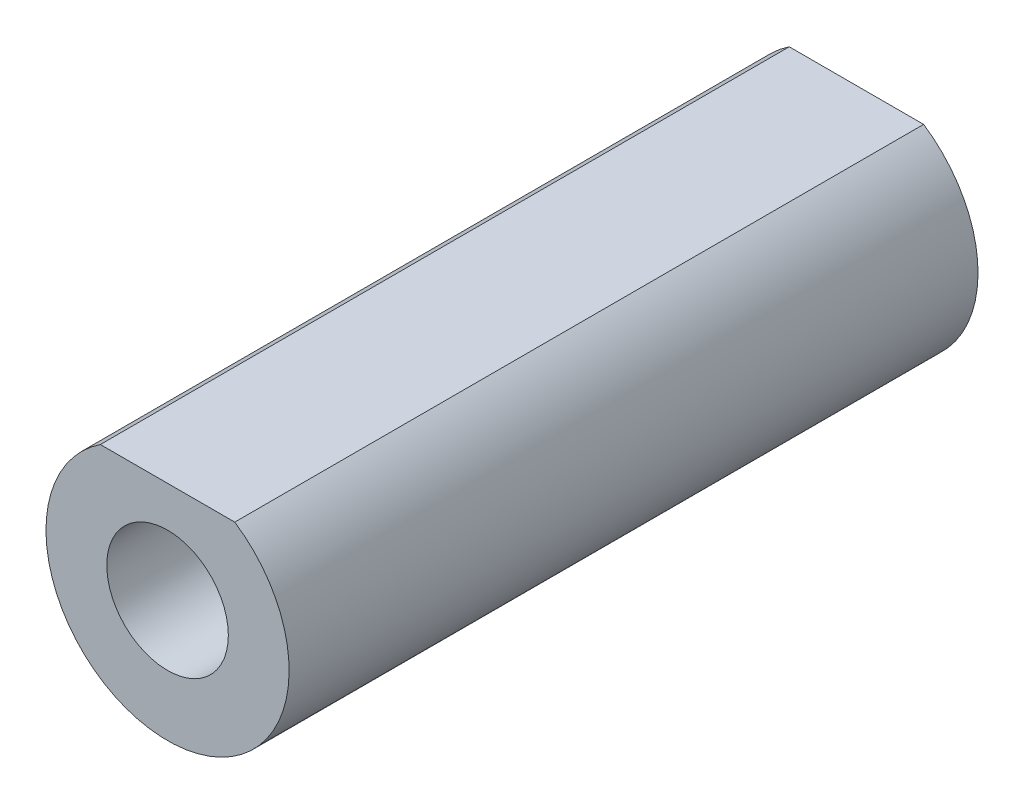
ISO-10303-21;
HEADER;
FILE_DESCRIPTION(('STEP AP214'),'2;1');
FILE_NAME('part.step','',(''),(''),'','','');
FILE_SCHEMA(('AUTOMOTIVE_DESIGN { 1 0 10303 214 1 1 1 1 }'));
ENDSEC;
DATA;
#1=APPLICATION_CONTEXT('core data for automotive mechanical design processes');
#2=APPLICATION_PROTOCOL_DEFINITION('international standard','automotive_design',2000,#1);
#3=PRODUCT_CONTEXT('',#1,'mechanical');
#4=PRODUCT('Part','Part','',(#3));
#5=PRODUCT_RELATED_PRODUCT_CATEGORY('part','',(#4));
#6=PRODUCT_DEFINITION_FORMATION('','',#4);
#7=PRODUCT_DEFINITION_CONTEXT('part definition',#1,'design');
#8=PRODUCT_DEFINITION('design','',#6,#7);
#9=PRODUCT_DEFINITION_SHAPE('','',#8);
#10=(LENGTH_UNIT() NAMED_UNIT(*) SI_UNIT(.MILLI.,.METRE.));
#11=(NAMED_UNIT(*) PLANE_ANGLE_UNIT() SI_UNIT($,.RADIAN.));
#12=(NAMED_UNIT(*) SI_UNIT($,.STERADIAN.) SOLID_ANGLE_UNIT());
#13=UNCERTAINTY_MEASURE_WITH_UNIT(LENGTH_MEASURE(1.E-05),#10,'distance_accuracy_value','');
#14=(GEOMETRIC_REPRESENTATION_CONTEXT(3) GLOBAL_UNCERTAINTY_ASSIGNED_CONTEXT((#13)) GLOBAL_UNIT_ASSIGNED_CONTEXT((#10,
#11,#12)) REPRESENTATION_CONTEXT('',''));
#15=CARTESIAN_POINT('',(0.,0.,0.));
#16=DIRECTION('',(0.,0.,1.));
#17=DIRECTION('',(1.,0.,0.));
#18=AXIS2_PLACEMENT_3D('',#15,#16,#17);
#19=CARTESIAN_POINT('',(0.,0.,34.));
#20=DIRECTION('',(0.,0.,1.));
#21=DIRECTION('',(1.,0.,0.));
#22=AXIS2_PLACEMENT_3D('',#19,#20,#21);
#23=PLANE('',#22);
#24=CARTESIAN_POINT('',(0.,0.,34.));
#25=DIRECTION('',(0.,0.,1.));
#26=DIRECTION('',(1.,0.,0.));
#27=AXIS2_PLACEMENT_3D('',#24,#25,#26);
#28=CIRCLE('',#27,6.);
#29=CARTESIAN_POINT('',(-3.3166247903554,5.,34.));
#30=VERTEX_POINT('',#29);
#31=CARTESIAN_POINT('',(3.3166247903554,5.,34.));
#32=VERTEX_POINT('',#31);
#33=EDGE_CURVE('E72',#30,#32,#28,.T.);
#34=ORIENTED_EDGE('',*,*,#33,.T.);
#35=DIRECTION('',(-1.,0.,0.));
#36=VECTOR('',#35,1.);
#37=CARTESIAN_POINT('',(0.,5.,34.));
#38=LINE('',#37,#36);
#39=EDGE_CURVE('E56',#32,#30,#38,.T.);
#40=ORIENTED_EDGE('',*,*,#39,.T.);
#41=EDGE_LOOP('',(#34,#40));
#42=FACE_BOUND('',#41,.T.);
#43=CARTESIAN_POINT('',(0.,0.,34.));
#44=DIRECTION('',(0.,0.,1.));
#45=DIRECTION('',(1.,0.,0.));
#46=AXIS2_PLACEMENT_3D('',#43,#44,#45);
#47=CIRCLE('',#46,3.);
#48=CARTESIAN_POINT('',(3.,0.,34.));
#49=VERTEX_POINT('',#48);
#50=EDGE_CURVE('E80',#49,#49,#47,.T.);
#51=ORIENTED_EDGE('',*,*,#50,.F.);
#52=EDGE_LOOP('',(#51));
#53=FACE_BOUND('',#52,.T.);
#54=ADVANCED_FACE('F39',(#42,#53),#23,.T.);
#55=CARTESIAN_POINT('',(0.,0.,0.));
#56=DIRECTION('',(0.,0.,1.));
#57=DIRECTION('',(1.,0.,0.));
#58=AXIS2_PLACEMENT_3D('',#55,#56,#57);
#59=PLANE('',#58);
#60=CARTESIAN_POINT('',(0.,0.,0.));
#61=DIRECTION('',(0.,0.,1.));
#62=DIRECTION('',(1.,0.,0.));
#63=AXIS2_PLACEMENT_3D('',#60,#61,#62);
#64=CIRCLE('',#63,6.);
#65=CARTESIAN_POINT('',(-3.3166247903554,5.,0.));
#66=VERTEX_POINT('',#65);
#67=CARTESIAN_POINT('',(3.3166247903554,5.,0.));
#68=VERTEX_POINT('',#67);
#69=EDGE_CURVE('E73',#66,#68,#64,.T.);
#70=ORIENTED_EDGE('',*,*,#69,.F.);
#71=DIRECTION('',(-1.,0.,0.));
#72=VECTOR('',#71,1.);
#73=CARTESIAN_POINT('',(0.,5.,0.));
#74=LINE('',#73,#72);
#75=EDGE_CURVE('E64',#68,#66,#74,.T.);
#76=ORIENTED_EDGE('',*,*,#75,.F.);
#77=EDGE_LOOP('',(#70,#76));
#78=FACE_BOUND('',#77,.T.);
#79=CARTESIAN_POINT('',(0.,0.,0.));
#80=DIRECTION('',(0.,0.,1.));
#81=DIRECTION('',(1.,0.,0.));
#82=AXIS2_PLACEMENT_3D('',#79,#80,#81);
#83=CIRCLE('',#82,3.);
#84=CARTESIAN_POINT('',(3.,0.,0.));
#85=VERTEX_POINT('',#84);
#86=EDGE_CURVE('E84',#85,#85,#83,.T.);
#87=ORIENTED_EDGE('',*,*,#86,.T.);
#88=EDGE_LOOP('',(#87));
#89=FACE_BOUND('',#88,.T.);
#90=ADVANCED_FACE('F77',(#78,#89),#59,.F.);
#91=CARTESIAN_POINT('',(0.,0.,34.));
#92=DIRECTION('',(0.,0.,-1.));
#93=DIRECTION('',(-1.,0.,0.));
#94=AXIS2_PLACEMENT_3D('',#91,#92,#93);
#95=CYLINDRICAL_SURFACE('',#94,6.);
#96=ORIENTED_EDGE('',*,*,#69,.T.);
#97=DIRECTION('',(0.,0.,-1.));
#98=VECTOR('',#97,1.);
#99=CARTESIAN_POINT('',(3.3166247903554,5.,34.));
#100=LINE('',#99,#98);
#101=EDGE_CURVE('E11',#32,#68,#100,.T.);
#102=ORIENTED_EDGE('',*,*,#101,.F.);
#103=ORIENTED_EDGE('',*,*,#33,.F.);
#104=DIRECTION('',(0.,0.,-1.));
#105=VECTOR('',#104,1.);
#106=CARTESIAN_POINT('',(-3.3166247903554,5.,34.));
#107=LINE('',#106,#105);
#108=EDGE_CURVE('E49',#30,#66,#107,.T.);
#109=ORIENTED_EDGE('',*,*,#108,.T.);
#110=EDGE_LOOP('',(#96,#102,#103,#109));
#111=FACE_BOUND('',#110,.T.);
#112=ADVANCED_FACE('F41',(#111),#95,.T.);
#113=CARTESIAN_POINT('',(0.,5.,34.));
#114=DIRECTION('',(0.,-1.,0.));
#115=DIRECTION('',(0.,0.,-1.));
#116=AXIS2_PLACEMENT_3D('',#113,#114,#115);
#117=PLANE('',#116);
#118=ORIENTED_EDGE('',*,*,#75,.T.);
#119=ORIENTED_EDGE('',*,*,#108,.F.);
#120=ORIENTED_EDGE('',*,*,#39,.F.);
#121=ORIENTED_EDGE('',*,*,#101,.T.);
#122=EDGE_LOOP('',(#118,#119,#120,#121));
#123=FACE_BOUND('',#122,.T.);
#124=ADVANCED_FACE('F67',(#123),#117,.F.);
#125=CARTESIAN_POINT('',(0.,0.,34.));
#126=DIRECTION('',(0.,0.,-1.));
#127=DIRECTION('',(-1.,0.,0.));
#128=AXIS2_PLACEMENT_3D('',#125,#126,#127);
#129=CYLINDRICAL_SURFACE('',#128,3.);
#130=ORIENTED_EDGE('',*,*,#50,.T.);
#131=EDGE_LOOP('',(#130));
#132=FACE_BOUND('',#131,.T.);
#133=ORIENTED_EDGE('',*,*,#86,.F.);
#134=EDGE_LOOP('',(#133));
#135=FACE_BOUND('',#134,.T.);
#136=ADVANCED_FACE('F95',(#132,#135),#129,.F.);
#137=CLOSED_SHELL('',(#54,#90,#112,#124,#136));
#138=MANIFOLD_SOLID_BREP('B2',#137);
#139=ADVANCED_BREP_SHAPE_REPRESENTATION('',(#18,#138),#14);
#140=SHAPE_DEFINITION_REPRESENTATION(#9,#139);
ENDSEC;
END-ISO-10303-21;
